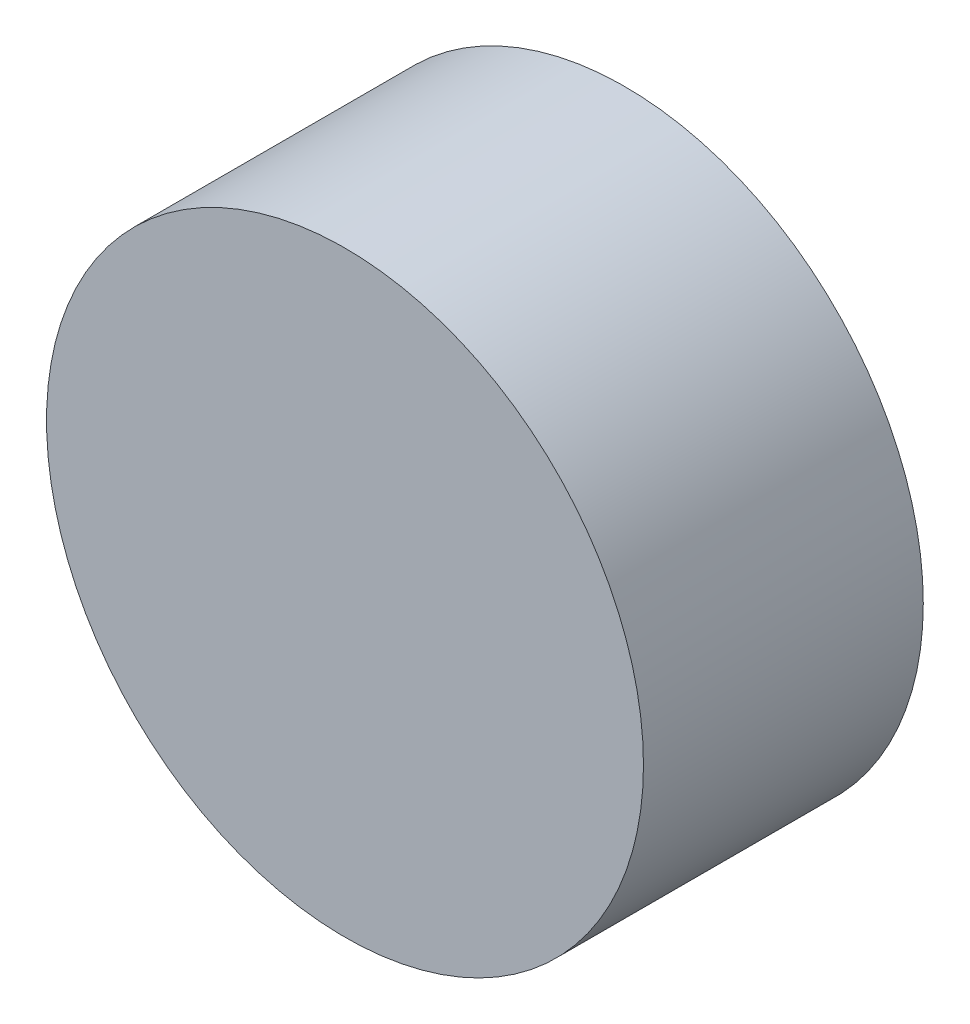
ISO-10303-21;
HEADER;
FILE_DESCRIPTION(('STEP AP214'),'2;1');
FILE_NAME('part.step','',(''),(''),'','','');
FILE_SCHEMA(('AUTOMOTIVE_DESIGN { 1 0 10303 214 1 1 1 1 }'));
ENDSEC;
DATA;
#1=APPLICATION_CONTEXT('core data for automotive mechanical design processes');
#2=APPLICATION_PROTOCOL_DEFINITION('international standard','automotive_design',2000,#1);
#3=PRODUCT_CONTEXT('',#1,'mechanical');
#4=PRODUCT('Part','Part','',(#3));
#5=PRODUCT_RELATED_PRODUCT_CATEGORY('part','',(#4));
#6=PRODUCT_DEFINITION_FORMATION('','',#4);
#7=PRODUCT_DEFINITION_CONTEXT('part definition',#1,'design');
#8=PRODUCT_DEFINITION('design','',#6,#7);
#9=PRODUCT_DEFINITION_SHAPE('','',#8);
#10=(LENGTH_UNIT() NAMED_UNIT(*) SI_UNIT(.MILLI.,.METRE.));
#11=(NAMED_UNIT(*) PLANE_ANGLE_UNIT() SI_UNIT($,.RADIAN.));
#12=(NAMED_UNIT(*) SI_UNIT($,.STERADIAN.) SOLID_ANGLE_UNIT());
#13=UNCERTAINTY_MEASURE_WITH_UNIT(LENGTH_MEASURE(1.E-05),#10,'distance_accuracy_value','');
#14=(GEOMETRIC_REPRESENTATION_CONTEXT(3) GLOBAL_UNCERTAINTY_ASSIGNED_CONTEXT((#13)) GLOBAL_UNIT_ASSIGNED_CONTEXT((#10,
#11,#12)) REPRESENTATION_CONTEXT('',''));
#15=CARTESIAN_POINT('',(0.,0.,0.));
#16=DIRECTION('',(0.,0.,1.));
#17=DIRECTION('',(1.,0.,0.));
#18=AXIS2_PLACEMENT_3D('',#15,#16,#17);
#19=CARTESIAN_POINT('',(0.,0.,30.));
#20=DIRECTION('',(0.,0.,-1.));
#21=DIRECTION('',(-1.,0.,0.));
#22=AXIS2_PLACEMENT_3D('',#19,#20,#21);
#23=CYLINDRICAL_SURFACE('',#22,32.);
#24=CARTESIAN_POINT('',(0.,0.,30.));
#25=DIRECTION('',(0.,0.,1.));
#26=DIRECTION('',(1.,0.,0.));
#27=AXIS2_PLACEMENT_3D('',#24,#25,#26);
#28=CIRCLE('',#27,32.);
#29=CARTESIAN_POINT('',(32.,0.,30.));
#30=VERTEX_POINT('',#29);
#31=EDGE_CURVE('E10',#30,#30,#28,.T.);
#32=ORIENTED_EDGE('',*,*,#31,.F.);
#33=EDGE_LOOP('',(#32));
#34=FACE_BOUND('',#33,.T.);
#35=CARTESIAN_POINT('',(0.,0.,0.));
#36=DIRECTION('',(0.,0.,1.));
#37=DIRECTION('',(1.,0.,0.));
#38=AXIS2_PLACEMENT_3D('',#35,#36,#37);
#39=CIRCLE('',#38,32.);
#40=CARTESIAN_POINT('',(32.,0.,0.));
#41=VERTEX_POINT('',#40);
#42=EDGE_CURVE('E46',#41,#41,#39,.T.);
#43=ORIENTED_EDGE('',*,*,#42,.T.);
#44=EDGE_LOOP('',(#43));
#45=FACE_BOUND('',#44,.T.);
#46=ADVANCED_FACE('F43',(#34,#45),#23,.T.);
#47=CARTESIAN_POINT('',(0.,0.,30.));
#48=DIRECTION('',(0.,0.,1.));
#49=DIRECTION('',(1.,0.,0.));
#50=AXIS2_PLACEMENT_3D('',#47,#48,#49);
#51=PLANE('',#50);
#52=ORIENTED_EDGE('',*,*,#31,.T.);
#53=EDGE_LOOP('',(#52));
#54=FACE_BOUND('',#53,.T.);
#55=ADVANCED_FACE('F60',(#54),#51,.T.);
#56=CARTESIAN_POINT('',(0.,0.,0.));
#57=DIRECTION('',(0.,0.,1.));
#58=DIRECTION('',(1.,0.,0.));
#59=AXIS2_PLACEMENT_3D('',#56,#57,#58);
#60=PLANE('',#59);
#61=ORIENTED_EDGE('',*,*,#42,.F.);
#62=EDGE_LOOP('',(#61));
#63=FACE_BOUND('',#62,.T.);
#64=ADVANCED_FACE('F58',(#63),#60,.F.);
#65=CLOSED_SHELL('',(#46,#55,#64));
#66=MANIFOLD_SOLID_BREP('B2',#65);
#67=ADVANCED_BREP_SHAPE_REPRESENTATION('',(#18,#66),#14);
#68=SHAPE_DEFINITION_REPRESENTATION(#9,#67);
ENDSEC;
END-ISO-10303-21;
